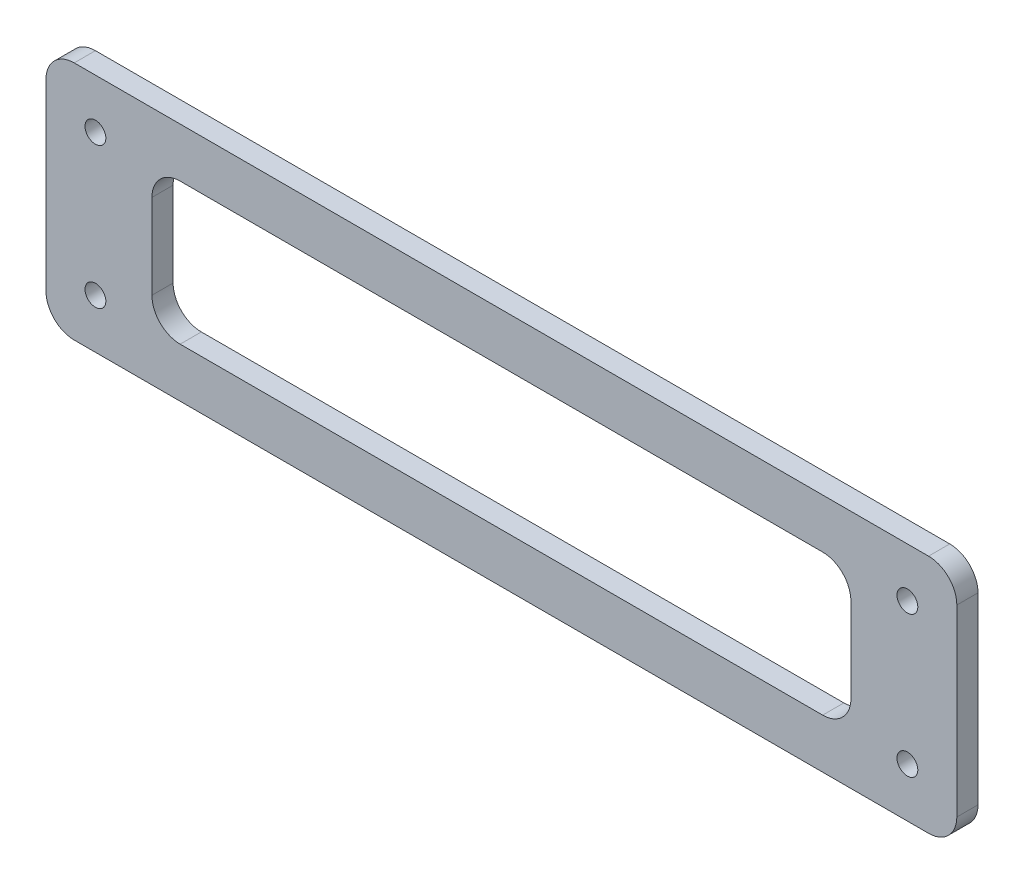
ISO-10303-21;
HEADER;
FILE_DESCRIPTION(('STEP AP214'),'2;1');
FILE_NAME('part.step','',(''),(''),'','','');
FILE_SCHEMA(('AUTOMOTIVE_DESIGN { 1 0 10303 214 1 1 1 1 }'));
ENDSEC;
DATA;
#1=APPLICATION_CONTEXT('core data for automotive mechanical design processes');
#2=APPLICATION_PROTOCOL_DEFINITION('international standard','automotive_design',2000,#1);
#3=PRODUCT_CONTEXT('',#1,'mechanical');
#4=PRODUCT('Part','Part','',(#3));
#5=PRODUCT_RELATED_PRODUCT_CATEGORY('part','',(#4));
#6=PRODUCT_DEFINITION_FORMATION('','',#4);
#7=PRODUCT_DEFINITION_CONTEXT('part definition',#1,'design');
#8=PRODUCT_DEFINITION('design','',#6,#7);
#9=PRODUCT_DEFINITION_SHAPE('','',#8);
#10=(LENGTH_UNIT() NAMED_UNIT(*) SI_UNIT(.MILLI.,.METRE.));
#11=(NAMED_UNIT(*) PLANE_ANGLE_UNIT() SI_UNIT($,.RADIAN.));
#12=(NAMED_UNIT(*) SI_UNIT($,.STERADIAN.) SOLID_ANGLE_UNIT());
#13=UNCERTAINTY_MEASURE_WITH_UNIT(LENGTH_MEASURE(1.E-05),#10,'distance_accuracy_value','');
#14=(GEOMETRIC_REPRESENTATION_CONTEXT(3) GLOBAL_UNCERTAINTY_ASSIGNED_CONTEXT((#13)) GLOBAL_UNIT_ASSIGNED_CONTEXT((#10,
#11,#12)) REPRESENTATION_CONTEXT('',''));
#15=CARTESIAN_POINT('',(0.,0.,0.));
#16=DIRECTION('',(0.,0.,1.));
#17=DIRECTION('',(1.,0.,0.));
#18=AXIS2_PLACEMENT_3D('',#15,#16,#17);
#19=CARTESIAN_POINT('',(0.,0.,3.));
#20=DIRECTION('',(0.,0.,-1.));
#21=DIRECTION('',(-1.,0.,0.));
#22=AXIS2_PLACEMENT_3D('',#19,#20,#21);
#23=PLANE('',#22);
#24=CARTESIAN_POINT('',(57.4999999999999,10.,3.));
#25=DIRECTION('',(0.,0.,1.));
#26=DIRECTION('',(-1.,0.,0.));
#27=AXIS2_PLACEMENT_3D('',#24,#25,#26);
#28=CIRCLE('',#27,1.475);
#29=CARTESIAN_POINT('',(56.0249999999999,10.,3.));
#30=VERTEX_POINT('',#29);
#31=EDGE_CURVE('E316',#30,#30,#28,.T.);
#32=ORIENTED_EDGE('',*,*,#31,.F.);
#33=EDGE_LOOP('',(#32));
#34=FACE_BOUND('',#33,.T.);
#35=CARTESIAN_POINT('',(57.5000000000001,-10.,3.));
#36=DIRECTION('',(0.,0.,1.));
#37=DIRECTION('',(-1.,0.,0.));
#38=AXIS2_PLACEMENT_3D('',#35,#36,#37);
#39=CIRCLE('',#38,1.475);
#40=CARTESIAN_POINT('',(56.0250000000001,-10.,3.));
#41=VERTEX_POINT('',#40);
#42=EDGE_CURVE('E325',#41,#41,#39,.T.);
#43=ORIENTED_EDGE('',*,*,#42,.F.);
#44=EDGE_LOOP('',(#43));
#45=FACE_BOUND('',#44,.T.);
#46=CARTESIAN_POINT('',(-57.5,-10.,3.));
#47=DIRECTION('',(0.,0.,1.));
#48=DIRECTION('',(1.,0.,0.));
#49=AXIS2_PLACEMENT_3D('',#46,#47,#48);
#50=CIRCLE('',#49,1.475);
#51=CARTESIAN_POINT('',(-56.025,-10.,3.));
#52=VERTEX_POINT('',#51);
#53=EDGE_CURVE('E333',#52,#52,#50,.T.);
#54=ORIENTED_EDGE('',*,*,#53,.F.);
#55=EDGE_LOOP('',(#54));
#56=FACE_BOUND('',#55,.T.);
#57=CARTESIAN_POINT('',(-57.5,10.,3.));
#58=DIRECTION('',(0.,0.,1.));
#59=DIRECTION('',(1.,0.,0.));
#60=AXIS2_PLACEMENT_3D('',#57,#58,#59);
#61=CIRCLE('',#60,1.475);
#62=CARTESIAN_POINT('',(-56.025,10.,3.));
#63=VERTEX_POINT('',#62);
#64=EDGE_CURVE('E341',#63,#63,#61,.T.);
#65=ORIENTED_EDGE('',*,*,#64,.F.);
#66=EDGE_LOOP('',(#65));
#67=FACE_BOUND('',#66,.T.);
#68=DIRECTION('',(1.,0.,0.));
#69=VECTOR('',#68,1.);
#70=CARTESIAN_POINT('',(-64.5,-17.,3.));
#71=LINE('',#70,#69);
#72=CARTESIAN_POINT('',(-60.5,-17.,3.));
#73=VERTEX_POINT('',#72);
#74=CARTESIAN_POINT('',(60.5,-17.,3.));
#75=VERTEX_POINT('',#74);
#76=EDGE_CURVE('E186',#73,#75,#71,.T.);
#77=ORIENTED_EDGE('',*,*,#76,.T.);
#78=CARTESIAN_POINT('',(60.5,-13.,3.));
#79=DIRECTION('',(0.,0.,-1.));
#80=DIRECTION('',(-1.,0.,0.));
#81=AXIS2_PLACEMENT_3D('',#78,#79,#80);
#82=CIRCLE('',#81,4.);
#83=CARTESIAN_POINT('',(64.5,-13.,3.));
#84=VERTEX_POINT('',#83);
#85=EDGE_CURVE('E252',#75,#84,#82,.F.);
#86=ORIENTED_EDGE('',*,*,#85,.T.);
#87=DIRECTION('',(0.,1.,0.));
#88=VECTOR('',#87,1.);
#89=CARTESIAN_POINT('',(64.5,-17.,3.));
#90=LINE('',#89,#88);
#91=CARTESIAN_POINT('',(64.5,13.,3.));
#92=VERTEX_POINT('',#91);
#93=EDGE_CURVE('E349',#84,#92,#90,.T.);
#94=ORIENTED_EDGE('',*,*,#93,.T.);
#95=CARTESIAN_POINT('',(60.5,13.,3.));
#96=DIRECTION('',(0.,0.,-1.));
#97=DIRECTION('',(-1.,0.,0.));
#98=AXIS2_PLACEMENT_3D('',#95,#96,#97);
#99=CIRCLE('',#98,4.);
#100=CARTESIAN_POINT('',(60.5,17.,3.));
#101=VERTEX_POINT('',#100);
#102=EDGE_CURVE('E246',#92,#101,#99,.F.);
#103=ORIENTED_EDGE('',*,*,#102,.T.);
#104=DIRECTION('',(-1.,0.,0.));
#105=VECTOR('',#104,1.);
#106=CARTESIAN_POINT('',(-64.5,17.,3.));
#107=LINE('',#106,#105);
#108=CARTESIAN_POINT('',(-60.5,17.,3.));
#109=VERTEX_POINT('',#108);
#110=EDGE_CURVE('E353',#101,#109,#107,.T.);
#111=ORIENTED_EDGE('',*,*,#110,.T.);
#112=CARTESIAN_POINT('',(-60.5,13.,3.));
#113=DIRECTION('',(0.,0.,-1.));
#114=DIRECTION('',(-1.,0.,0.));
#115=AXIS2_PLACEMENT_3D('',#112,#113,#114);
#116=CIRCLE('',#115,4.);
#117=CARTESIAN_POINT('',(-64.5,13.,3.));
#118=VERTEX_POINT('',#117);
#119=EDGE_CURVE('E68',#109,#118,#116,.F.);
#120=ORIENTED_EDGE('',*,*,#119,.T.);
#121=DIRECTION('',(0.,-1.,0.));
#122=VECTOR('',#121,1.);
#123=CARTESIAN_POINT('',(-64.5,-17.,3.));
#124=LINE('',#123,#122);
#125=CARTESIAN_POINT('',(-64.5,-13.,3.));
#126=VERTEX_POINT('',#125);
#127=EDGE_CURVE('E193',#118,#126,#124,.T.);
#128=ORIENTED_EDGE('',*,*,#127,.T.);
#129=CARTESIAN_POINT('',(-60.5,-13.,3.));
#130=DIRECTION('',(0.,0.,-1.));
#131=DIRECTION('',(-1.,0.,0.));
#132=AXIS2_PLACEMENT_3D('',#129,#130,#131);
#133=CIRCLE('',#132,4.);
#134=EDGE_CURVE('E249',#126,#73,#133,.F.);
#135=ORIENTED_EDGE('',*,*,#134,.T.);
#136=EDGE_LOOP('',(#77,#86,#94,#103,#111,#120,#128,#135));
#137=FACE_BOUND('',#136,.T.);
#138=DIRECTION('',(0.,1.,0.));
#139=VECTOR('',#138,1.);
#140=CARTESIAN_POINT('',(49.5,-10.,3.));
#141=LINE('',#140,#139);
#142=CARTESIAN_POINT('',(49.5,-6.,3.));
#143=VERTEX_POINT('',#142);
#144=CARTESIAN_POINT('',(49.5,6.,3.));
#145=VERTEX_POINT('',#144);
#146=EDGE_CURVE('E308',#143,#145,#141,.T.);
#147=ORIENTED_EDGE('',*,*,#146,.F.);
#148=CARTESIAN_POINT('',(45.5,-6.,3.));
#149=DIRECTION('',(0.,0.,-1.));
#150=DIRECTION('',(-1.,0.,0.));
#151=AXIS2_PLACEMENT_3D('',#148,#149,#150);
#152=CIRCLE('',#151,4.);
#153=CARTESIAN_POINT('',(45.5,-10.,3.));
#154=VERTEX_POINT('',#153);
#155=EDGE_CURVE('E11',#143,#154,#152,.T.);
#156=ORIENTED_EDGE('',*,*,#155,.T.);
#157=DIRECTION('',(1.,0.,0.));
#158=VECTOR('',#157,1.);
#159=CARTESIAN_POINT('',(-49.5,-10.,3.));
#160=LINE('',#159,#158);
#161=CARTESIAN_POINT('',(-45.5,-10.,3.));
#162=VERTEX_POINT('',#161);
#163=EDGE_CURVE('E292',#162,#154,#160,.T.);
#164=ORIENTED_EDGE('',*,*,#163,.F.);
#165=CARTESIAN_POINT('',(-45.5,-6.,3.));
#166=DIRECTION('',(0.,0.,-1.));
#167=DIRECTION('',(-1.,0.,0.));
#168=AXIS2_PLACEMENT_3D('',#165,#166,#167);
#169=CIRCLE('',#168,4.);
#170=CARTESIAN_POINT('',(-49.5,-6.,3.));
#171=VERTEX_POINT('',#170);
#172=EDGE_CURVE('E171',#162,#171,#169,.T.);
#173=ORIENTED_EDGE('',*,*,#172,.T.);
#174=DIRECTION('',(0.,-1.,0.));
#175=VECTOR('',#174,1.);
#176=CARTESIAN_POINT('',(-49.5,-10.,3.));
#177=LINE('',#176,#175);
#178=CARTESIAN_POINT('',(-49.5,6.,3.));
#179=VERTEX_POINT('',#178);
#180=EDGE_CURVE('E289',#179,#171,#177,.T.);
#181=ORIENTED_EDGE('',*,*,#180,.F.);
#182=CARTESIAN_POINT('',(-45.5,6.,3.));
#183=DIRECTION('',(0.,0.,-1.));
#184=DIRECTION('',(-1.,0.,0.));
#185=AXIS2_PLACEMENT_3D('',#182,#183,#184);
#186=CIRCLE('',#185,4.);
#187=CARTESIAN_POINT('',(-45.5,10.,3.));
#188=VERTEX_POINT('',#187);
#189=EDGE_CURVE('E277',#179,#188,#186,.T.);
#190=ORIENTED_EDGE('',*,*,#189,.T.);
#191=DIRECTION('',(-1.,0.,0.));
#192=VECTOR('',#191,1.);
#193=CARTESIAN_POINT('',(-49.5,10.,3.));
#194=LINE('',#193,#192);
#195=CARTESIAN_POINT('',(45.5,10.,3.));
#196=VERTEX_POINT('',#195);
#197=EDGE_CURVE('E301',#196,#188,#194,.T.);
#198=ORIENTED_EDGE('',*,*,#197,.F.);
#199=CARTESIAN_POINT('',(45.5,6.,3.));
#200=DIRECTION('',(0.,0.,-1.));
#201=DIRECTION('',(-1.,0.,0.));
#202=AXIS2_PLACEMENT_3D('',#199,#200,#201);
#203=CIRCLE('',#202,4.);
#204=EDGE_CURVE('E271',#196,#145,#203,.T.);
#205=ORIENTED_EDGE('',*,*,#204,.T.);
#206=EDGE_LOOP('',(#147,#156,#164,#173,#181,#190,#198,#205));
#207=FACE_BOUND('',#206,.T.);
#208=ADVANCED_FACE('F45',(#34,#45,#56,#67,#137,#207),#23,.F.);
#209=CARTESIAN_POINT('',(0.,0.,0.));
#210=DIRECTION('',(0.,0.,-1.));
#211=DIRECTION('',(-1.,0.,0.));
#212=AXIS2_PLACEMENT_3D('',#209,#210,#211);
#213=PLANE('',#212);
#214=CARTESIAN_POINT('',(57.5000000000001,-10.,0.));
#215=DIRECTION('',(0.,0.,1.));
#216=DIRECTION('',(-1.,0.,0.));
#217=AXIS2_PLACEMENT_3D('',#214,#215,#216);
#218=CIRCLE('',#217,1.475);
#219=CARTESIAN_POINT('',(56.0250000000001,-10.,0.));
#220=VERTEX_POINT('',#219);
#221=EDGE_CURVE('E320',#220,#220,#218,.T.);
#222=ORIENTED_EDGE('',*,*,#221,.T.);
#223=EDGE_LOOP('',(#222));
#224=FACE_BOUND('',#223,.T.);
#225=CARTESIAN_POINT('',(-57.5,10.,0.));
#226=DIRECTION('',(0.,0.,1.));
#227=DIRECTION('',(1.,0.,0.));
#228=AXIS2_PLACEMENT_3D('',#225,#226,#227);
#229=CIRCLE('',#228,1.475);
#230=CARTESIAN_POINT('',(-56.025,10.,0.));
#231=VERTEX_POINT('',#230);
#232=EDGE_CURVE('E337',#231,#231,#229,.T.);
#233=ORIENTED_EDGE('',*,*,#232,.T.);
#234=EDGE_LOOP('',(#233));
#235=FACE_BOUND('',#234,.T.);
#236=DIRECTION('',(0.,1.,0.));
#237=VECTOR('',#236,1.);
#238=CARTESIAN_POINT('',(64.5,-17.,0.));
#239=LINE('',#238,#237);
#240=CARTESIAN_POINT('',(64.5,-13.,0.));
#241=VERTEX_POINT('',#240);
#242=CARTESIAN_POINT('',(64.5,13.,0.));
#243=VERTEX_POINT('',#242);
#244=EDGE_CURVE('E345',#241,#243,#239,.T.);
#245=ORIENTED_EDGE('',*,*,#244,.F.);
#246=CARTESIAN_POINT('',(60.5,-13.,0.));
#247=DIRECTION('',(0.,0.,-1.));
#248=DIRECTION('',(-1.,0.,0.));
#249=AXIS2_PLACEMENT_3D('',#246,#247,#248);
#250=CIRCLE('',#249,4.);
#251=CARTESIAN_POINT('',(60.5,-17.,0.));
#252=VERTEX_POINT('',#251);
#253=EDGE_CURVE('E234',#241,#252,#250,.T.);
#254=ORIENTED_EDGE('',*,*,#253,.T.);
#255=DIRECTION('',(1.,0.,0.));
#256=VECTOR('',#255,1.);
#257=CARTESIAN_POINT('',(-64.5,-17.,0.));
#258=LINE('',#257,#256);
#259=CARTESIAN_POINT('',(-60.5,-17.,0.));
#260=VERTEX_POINT('',#259);
#261=EDGE_CURVE('E196',#260,#252,#258,.T.);
#262=ORIENTED_EDGE('',*,*,#261,.F.);
#263=CARTESIAN_POINT('',(-60.5,-13.,0.));
#264=DIRECTION('',(0.,0.,-1.));
#265=DIRECTION('',(-1.,0.,0.));
#266=AXIS2_PLACEMENT_3D('',#263,#264,#265);
#267=CIRCLE('',#266,4.);
#268=CARTESIAN_POINT('',(-64.5,-13.,0.));
#269=VERTEX_POINT('',#268);
#270=EDGE_CURVE('E231',#260,#269,#267,.T.);
#271=ORIENTED_EDGE('',*,*,#270,.T.);
#272=DIRECTION('',(0.,-1.,0.));
#273=VECTOR('',#272,1.);
#274=CARTESIAN_POINT('',(-64.5,-17.,0.));
#275=LINE('',#274,#273);
#276=CARTESIAN_POINT('',(-64.5,13.,0.));
#277=VERTEX_POINT('',#276);
#278=EDGE_CURVE('E364',#277,#269,#275,.T.);
#279=ORIENTED_EDGE('',*,*,#278,.F.);
#280=CARTESIAN_POINT('',(-60.5,13.,0.));
#281=DIRECTION('',(0.,0.,-1.));
#282=DIRECTION('',(-1.,0.,0.));
#283=AXIS2_PLACEMENT_3D('',#280,#281,#282);
#284=CIRCLE('',#283,4.);
#285=CARTESIAN_POINT('',(-60.5,17.,0.));
#286=VERTEX_POINT('',#285);
#287=EDGE_CURVE('E225',#277,#286,#284,.T.);
#288=ORIENTED_EDGE('',*,*,#287,.T.);
#289=DIRECTION('',(-1.,0.,0.));
#290=VECTOR('',#289,1.);
#291=CARTESIAN_POINT('',(-64.5,17.,0.));
#292=LINE('',#291,#290);
#293=CARTESIAN_POINT('',(60.5,17.,0.));
#294=VERTEX_POINT('',#293);
#295=EDGE_CURVE('E361',#294,#286,#292,.T.);
#296=ORIENTED_EDGE('',*,*,#295,.F.);
#297=CARTESIAN_POINT('',(60.5,13.,0.));
#298=DIRECTION('',(0.,0.,-1.));
#299=DIRECTION('',(-1.,0.,0.));
#300=AXIS2_PLACEMENT_3D('',#297,#298,#299);
#301=CIRCLE('',#300,4.);
#302=EDGE_CURVE('E228',#294,#243,#301,.T.);
#303=ORIENTED_EDGE('',*,*,#302,.T.);
#304=EDGE_LOOP('',(#245,#254,#262,#271,#279,#288,#296,#303));
#305=FACE_BOUND('',#304,.T.);
#306=CARTESIAN_POINT('',(-57.5,-10.,0.));
#307=DIRECTION('',(0.,0.,1.));
#308=DIRECTION('',(1.,0.,0.));
#309=AXIS2_PLACEMENT_3D('',#306,#307,#308);
#310=CIRCLE('',#309,1.475);
#311=CARTESIAN_POINT('',(-56.025,-10.,0.));
#312=VERTEX_POINT('',#311);
#313=EDGE_CURVE('E329',#312,#312,#310,.T.);
#314=ORIENTED_EDGE('',*,*,#313,.T.);
#315=EDGE_LOOP('',(#314));
#316=FACE_BOUND('',#315,.T.);
#317=CARTESIAN_POINT('',(57.4999999999999,10.,0.));
#318=DIRECTION('',(0.,0.,1.));
#319=DIRECTION('',(-1.,0.,0.));
#320=AXIS2_PLACEMENT_3D('',#317,#318,#319);
#321=CIRCLE('',#320,1.475);
#322=CARTESIAN_POINT('',(56.0249999999999,10.,0.));
#323=VERTEX_POINT('',#322);
#324=EDGE_CURVE('E321',#323,#323,#321,.T.);
#325=ORIENTED_EDGE('',*,*,#324,.T.);
#326=EDGE_LOOP('',(#325));
#327=FACE_BOUND('',#326,.T.);
#328=DIRECTION('',(0.,-1.,0.));
#329=VECTOR('',#328,1.);
#330=CARTESIAN_POINT('',(-49.5,-10.,0.));
#331=LINE('',#330,#329);
#332=CARTESIAN_POINT('',(-49.5,6.,0.));
#333=VERTEX_POINT('',#332);
#334=CARTESIAN_POINT('',(-49.5,-6.,0.));
#335=VERTEX_POINT('',#334);
#336=EDGE_CURVE('E304',#333,#335,#331,.T.);
#337=ORIENTED_EDGE('',*,*,#336,.T.);
#338=CARTESIAN_POINT('',(-45.5,-6.,0.));
#339=DIRECTION('',(0.,0.,-1.));
#340=DIRECTION('',(-1.,0.,0.));
#341=AXIS2_PLACEMENT_3D('',#338,#339,#340);
#342=CIRCLE('',#341,4.);
#343=CARTESIAN_POINT('',(-45.5,-10.,0.));
#344=VERTEX_POINT('',#343);
#345=EDGE_CURVE('E280',#335,#344,#342,.F.);
#346=ORIENTED_EDGE('',*,*,#345,.T.);
#347=DIRECTION('',(1.,0.,0.));
#348=VECTOR('',#347,1.);
#349=CARTESIAN_POINT('',(-49.5,-10.,0.));
#350=LINE('',#349,#348);
#351=CARTESIAN_POINT('',(45.5,-10.,0.));
#352=VERTEX_POINT('',#351);
#353=EDGE_CURVE('E165',#344,#352,#350,.T.);
#354=ORIENTED_EDGE('',*,*,#353,.T.);
#355=CARTESIAN_POINT('',(45.5,-6.,0.));
#356=DIRECTION('',(0.,0.,-1.));
#357=DIRECTION('',(-1.,0.,0.));
#358=AXIS2_PLACEMENT_3D('',#355,#356,#357);
#359=CIRCLE('',#358,4.);
#360=CARTESIAN_POINT('',(49.5,-6.,0.));
#361=VERTEX_POINT('',#360);
#362=EDGE_CURVE('E54',#352,#361,#359,.F.);
#363=ORIENTED_EDGE('',*,*,#362,.T.);
#364=DIRECTION('',(0.,1.,0.));
#365=VECTOR('',#364,1.);
#366=CARTESIAN_POINT('',(49.5,-10.,0.));
#367=LINE('',#366,#365);
#368=CARTESIAN_POINT('',(49.5,6.,0.));
#369=VERTEX_POINT('',#368);
#370=EDGE_CURVE('E163',#361,#369,#367,.T.);
#371=ORIENTED_EDGE('',*,*,#370,.T.);
#372=CARTESIAN_POINT('',(45.5,6.,0.));
#373=DIRECTION('',(0.,0.,-1.));
#374=DIRECTION('',(-1.,0.,0.));
#375=AXIS2_PLACEMENT_3D('',#372,#373,#374);
#376=CIRCLE('',#375,4.);
#377=CARTESIAN_POINT('',(45.5,10.,0.));
#378=VERTEX_POINT('',#377);
#379=EDGE_CURVE('E268',#369,#378,#376,.F.);
#380=ORIENTED_EDGE('',*,*,#379,.T.);
#381=DIRECTION('',(-1.,0.,0.));
#382=VECTOR('',#381,1.);
#383=CARTESIAN_POINT('',(-49.5,10.,0.));
#384=LINE('',#383,#382);
#385=CARTESIAN_POINT('',(-45.5,10.,0.));
#386=VERTEX_POINT('',#385);
#387=EDGE_CURVE('E181',#378,#386,#384,.T.);
#388=ORIENTED_EDGE('',*,*,#387,.T.);
#389=CARTESIAN_POINT('',(-45.5,6.,0.));
#390=DIRECTION('',(0.,0.,-1.));
#391=DIRECTION('',(-1.,0.,0.));
#392=AXIS2_PLACEMENT_3D('',#389,#390,#391);
#393=CIRCLE('',#392,4.);
#394=EDGE_CURVE('E274',#386,#333,#393,.F.);
#395=ORIENTED_EDGE('',*,*,#394,.T.);
#396=EDGE_LOOP('',(#337,#346,#354,#363,#371,#380,#388,#395));
#397=FACE_BOUND('',#396,.T.);
#398=ADVANCED_FACE('F162',(#224,#235,#305,#316,#327,#397),#213,.T.);
#399=CARTESIAN_POINT('',(64.5,-17.,3.));
#400=DIRECTION('',(-1.,0.,0.));
#401=DIRECTION('',(0.,-1.,0.));
#402=AXIS2_PLACEMENT_3D('',#399,#400,#401);
#403=PLANE('',#402);
#404=ORIENTED_EDGE('',*,*,#93,.F.);
#405=DIRECTION('',(0.,0.,-1.));
#406=VECTOR('',#405,1.);
#407=CARTESIAN_POINT('',(64.5,-13.,3.));
#408=LINE('',#407,#406);
#409=EDGE_CURVE('E221',#84,#241,#408,.T.);
#410=ORIENTED_EDGE('',*,*,#409,.T.);
#411=ORIENTED_EDGE('',*,*,#244,.T.);
#412=DIRECTION('',(0.,0.,-1.));
#413=VECTOR('',#412,1.);
#414=CARTESIAN_POINT('',(64.5,13.,3.));
#415=LINE('',#414,#413);
#416=EDGE_CURVE('E218',#243,#92,#415,.F.);
#417=ORIENTED_EDGE('',*,*,#416,.T.);
#418=EDGE_LOOP('',(#404,#410,#411,#417));
#419=FACE_BOUND('',#418,.T.);
#420=ADVANCED_FACE('F383',(#419),#403,.F.);
#421=CARTESIAN_POINT('',(-64.5,17.,3.));
#422=DIRECTION('',(0.,-1.,0.));
#423=DIRECTION('',(0.,0.,-1.));
#424=AXIS2_PLACEMENT_3D('',#421,#422,#423);
#425=PLANE('',#424);
#426=ORIENTED_EDGE('',*,*,#110,.F.);
#427=DIRECTION('',(0.,0.,-1.));
#428=VECTOR('',#427,1.);
#429=CARTESIAN_POINT('',(60.5,17.,3.));
#430=LINE('',#429,#428);
#431=EDGE_CURVE('E264',#101,#294,#430,.T.);
#432=ORIENTED_EDGE('',*,*,#431,.T.);
#433=ORIENTED_EDGE('',*,*,#295,.T.);
#434=DIRECTION('',(0.,0.,-1.));
#435=VECTOR('',#434,1.);
#436=CARTESIAN_POINT('',(-60.5,17.,3.));
#437=LINE('',#436,#435);
#438=EDGE_CURVE('E261',#286,#109,#437,.F.);
#439=ORIENTED_EDGE('',*,*,#438,.T.);
#440=EDGE_LOOP('',(#426,#432,#433,#439));
#441=FACE_BOUND('',#440,.T.);
#442=ADVANCED_FACE('F391',(#441),#425,.F.);
#443=CARTESIAN_POINT('',(-64.5,-17.,3.));
#444=DIRECTION('',(1.,0.,0.));
#445=DIRECTION('',(0.,1.,0.));
#446=AXIS2_PLACEMENT_3D('',#443,#444,#445);
#447=PLANE('',#446);
#448=ORIENTED_EDGE('',*,*,#278,.T.);
#449=DIRECTION('',(0.,0.,-1.));
#450=VECTOR('',#449,1.);
#451=CARTESIAN_POINT('',(-64.5,-13.,3.));
#452=LINE('',#451,#450);
#453=EDGE_CURVE('E61',#269,#126,#452,.F.);
#454=ORIENTED_EDGE('',*,*,#453,.T.);
#455=ORIENTED_EDGE('',*,*,#127,.F.);
#456=DIRECTION('',(0.,0.,-1.));
#457=VECTOR('',#456,1.);
#458=CARTESIAN_POINT('',(-64.5,13.,3.));
#459=LINE('',#458,#457);
#460=EDGE_CURVE('E255',#118,#277,#459,.T.);
#461=ORIENTED_EDGE('',*,*,#460,.T.);
#462=EDGE_LOOP('',(#448,#454,#455,#461));
#463=FACE_BOUND('',#462,.T.);
#464=ADVANCED_FACE('F396',(#463),#447,.F.);
#465=CARTESIAN_POINT('',(-64.5,-17.,3.));
#466=DIRECTION('',(0.,1.,0.));
#467=DIRECTION('',(0.,0.,1.));
#468=AXIS2_PLACEMENT_3D('',#465,#466,#467);
#469=PLANE('',#468);
#470=ORIENTED_EDGE('',*,*,#261,.T.);
#471=DIRECTION('',(0.,0.,-1.));
#472=VECTOR('',#471,1.);
#473=CARTESIAN_POINT('',(60.5,-17.,3.));
#474=LINE('',#473,#472);
#475=EDGE_CURVE('E241',#252,#75,#474,.F.);
#476=ORIENTED_EDGE('',*,*,#475,.T.);
#477=ORIENTED_EDGE('',*,*,#76,.F.);
#478=DIRECTION('',(0.,0.,-1.));
#479=VECTOR('',#478,1.);
#480=CARTESIAN_POINT('',(-60.5,-17.,3.));
#481=LINE('',#480,#479);
#482=EDGE_CURVE('E237',#73,#260,#481,.T.);
#483=ORIENTED_EDGE('',*,*,#482,.T.);
#484=EDGE_LOOP('',(#470,#476,#477,#483));
#485=FACE_BOUND('',#484,.T.);
#486=ADVANCED_FACE('F372',(#485),#469,.F.);
#487=CARTESIAN_POINT('',(-57.5,10.,3.));
#488=DIRECTION('',(0.,0.,-1.));
#489=DIRECTION('',(-1.,0.,0.));
#490=AXIS2_PLACEMENT_3D('',#487,#488,#489);
#491=CYLINDRICAL_SURFACE('',#490,1.475);
#492=ORIENTED_EDGE('',*,*,#64,.T.);
#493=EDGE_LOOP('',(#492));
#494=FACE_BOUND('',#493,.T.);
#495=ORIENTED_EDGE('',*,*,#232,.F.);
#496=EDGE_LOOP('',(#495));
#497=FACE_BOUND('',#496,.T.);
#498=ADVANCED_FACE('F420',(#494,#497),#491,.F.);
#499=CARTESIAN_POINT('',(-57.5,-10.,3.));
#500=DIRECTION('',(0.,0.,-1.));
#501=DIRECTION('',(-1.,0.,0.));
#502=AXIS2_PLACEMENT_3D('',#499,#500,#501);
#503=CYLINDRICAL_SURFACE('',#502,1.475);
#504=ORIENTED_EDGE('',*,*,#53,.T.);
#505=EDGE_LOOP('',(#504));
#506=FACE_BOUND('',#505,.T.);
#507=ORIENTED_EDGE('',*,*,#313,.F.);
#508=EDGE_LOOP('',(#507));
#509=FACE_BOUND('',#508,.T.);
#510=ADVANCED_FACE('F531',(#506,#509),#503,.F.);
#511=CARTESIAN_POINT('',(57.5000000000001,-10.,3.));
#512=DIRECTION('',(0.,0.,-1.));
#513=DIRECTION('',(-1.,0.,0.));
#514=AXIS2_PLACEMENT_3D('',#511,#512,#513);
#515=CYLINDRICAL_SURFACE('',#514,1.475);
#516=ORIENTED_EDGE('',*,*,#42,.T.);
#517=EDGE_LOOP('',(#516));
#518=FACE_BOUND('',#517,.T.);
#519=ORIENTED_EDGE('',*,*,#221,.F.);
#520=EDGE_LOOP('',(#519));
#521=FACE_BOUND('',#520,.T.);
#522=ADVANCED_FACE('F522',(#518,#521),#515,.F.);
#523=CARTESIAN_POINT('',(57.4999999999999,10.,3.));
#524=DIRECTION('',(0.,0.,-1.));
#525=DIRECTION('',(-1.,0.,0.));
#526=AXIS2_PLACEMENT_3D('',#523,#524,#525);
#527=CYLINDRICAL_SURFACE('',#526,1.475);
#528=ORIENTED_EDGE('',*,*,#31,.T.);
#529=EDGE_LOOP('',(#528));
#530=FACE_BOUND('',#529,.T.);
#531=ORIENTED_EDGE('',*,*,#324,.F.);
#532=EDGE_LOOP('',(#531));
#533=FACE_BOUND('',#532,.T.);
#534=ADVANCED_FACE('F515',(#530,#533),#527,.F.);
#535=CARTESIAN_POINT('',(49.5,-10.,3.));
#536=DIRECTION('',(-1.,0.,0.));
#537=DIRECTION('',(0.,0.,1.));
#538=AXIS2_PLACEMENT_3D('',#535,#536,#537);
#539=PLANE('',#538);
#540=ORIENTED_EDGE('',*,*,#146,.T.);
#541=DIRECTION('',(0.,0.,-1.));
#542=VECTOR('',#541,1.);
#543=CARTESIAN_POINT('',(49.5,6.,0.));
#544=LINE('',#543,#542);
#545=EDGE_CURVE('E179',#145,#369,#544,.T.);
#546=ORIENTED_EDGE('',*,*,#545,.T.);
#547=ORIENTED_EDGE('',*,*,#370,.F.);
#548=DIRECTION('',(0.,0.,-1.));
#549=VECTOR('',#548,1.);
#550=CARTESIAN_POINT('',(49.5,-6.,3.));
#551=LINE('',#550,#549);
#552=EDGE_CURVE('E176',#361,#143,#551,.F.);
#553=ORIENTED_EDGE('',*,*,#552,.T.);
#554=EDGE_LOOP('',(#540,#546,#547,#553));
#555=FACE_BOUND('',#554,.T.);
#556=ADVANCED_FACE('F175',(#555),#539,.T.);
#557=CARTESIAN_POINT('',(-49.5,10.,3.));
#558=DIRECTION('',(0.,-1.,0.));
#559=DIRECTION('',(0.,0.,-1.));
#560=AXIS2_PLACEMENT_3D('',#557,#558,#559);
#561=PLANE('',#560);
#562=ORIENTED_EDGE('',*,*,#387,.F.);
#563=DIRECTION('',(0.,0.,-1.));
#564=VECTOR('',#563,1.);
#565=CARTESIAN_POINT('',(45.5,10.,3.));
#566=LINE('',#565,#564);
#567=EDGE_CURVE('E202',#378,#196,#566,.F.);
#568=ORIENTED_EDGE('',*,*,#567,.T.);
#569=ORIENTED_EDGE('',*,*,#197,.T.);
#570=DIRECTION('',(0.,0.,-1.));
#571=VECTOR('',#570,1.);
#572=CARTESIAN_POINT('',(-45.5,10.,0.));
#573=LINE('',#572,#571);
#574=EDGE_CURVE('E190',#188,#386,#573,.T.);
#575=ORIENTED_EDGE('',*,*,#574,.T.);
#576=EDGE_LOOP('',(#562,#568,#569,#575));
#577=FACE_BOUND('',#576,.T.);
#578=ADVANCED_FACE('F499',(#577),#561,.T.);
#579=CARTESIAN_POINT('',(-49.5,-10.,3.));
#580=DIRECTION('',(1.,0.,0.));
#581=DIRECTION('',(0.,0.,-1.));
#582=AXIS2_PLACEMENT_3D('',#579,#580,#581);
#583=PLANE('',#582);
#584=ORIENTED_EDGE('',*,*,#336,.F.);
#585=DIRECTION('',(0.,0.,-1.));
#586=VECTOR('',#585,1.);
#587=CARTESIAN_POINT('',(-49.5,6.,3.));
#588=LINE('',#587,#586);
#589=EDGE_CURVE('E209',#333,#179,#588,.F.);
#590=ORIENTED_EDGE('',*,*,#589,.T.);
#591=ORIENTED_EDGE('',*,*,#180,.T.);
#592=DIRECTION('',(0.,0.,-1.));
#593=VECTOR('',#592,1.);
#594=CARTESIAN_POINT('',(-49.5,-6.,0.));
#595=LINE('',#594,#593);
#596=EDGE_CURVE('E205',#171,#335,#595,.T.);
#597=ORIENTED_EDGE('',*,*,#596,.T.);
#598=EDGE_LOOP('',(#584,#590,#591,#597));
#599=FACE_BOUND('',#598,.T.);
#600=ADVANCED_FACE('F298',(#599),#583,.T.);
#601=CARTESIAN_POINT('',(-49.5,-10.,3.));
#602=DIRECTION('',(0.,1.,0.));
#603=DIRECTION('',(0.,0.,1.));
#604=AXIS2_PLACEMENT_3D('',#601,#602,#603);
#605=PLANE('',#604);
#606=ORIENTED_EDGE('',*,*,#353,.F.);
#607=DIRECTION('',(0.,0.,-1.));
#608=VECTOR('',#607,1.);
#609=CARTESIAN_POINT('',(-45.5,-10.,3.));
#610=LINE('',#609,#608);
#611=EDGE_CURVE('E215',#344,#162,#610,.F.);
#612=ORIENTED_EDGE('',*,*,#611,.T.);
#613=ORIENTED_EDGE('',*,*,#163,.T.);
#614=DIRECTION('',(0.,0.,-1.));
#615=VECTOR('',#614,1.);
#616=CARTESIAN_POINT('',(45.5,-10.,0.));
#617=LINE('',#616,#615);
#618=EDGE_CURVE('E212',#154,#352,#617,.T.);
#619=ORIENTED_EDGE('',*,*,#618,.T.);
#620=EDGE_LOOP('',(#606,#612,#613,#619));
#621=FACE_BOUND('',#620,.T.);
#622=ADVANCED_FACE('F306',(#621),#605,.T.);
#623=CARTESIAN_POINT('',(45.5,6.,3.));
#624=DIRECTION('',(0.,0.,1.));
#625=DIRECTION('',(1.,0.,0.));
#626=AXIS2_PLACEMENT_3D('',#623,#624,#625);
#627=CYLINDRICAL_SURFACE('',#626,4.);
#628=ORIENTED_EDGE('',*,*,#204,.F.);
#629=ORIENTED_EDGE('',*,*,#567,.F.);
#630=ORIENTED_EDGE('',*,*,#379,.F.);
#631=ORIENTED_EDGE('',*,*,#545,.F.);
#632=EDGE_LOOP('',(#628,#629,#630,#631));
#633=FACE_BOUND('',#632,.T.);
#634=ADVANCED_FACE('F431',(#633),#627,.F.);
#635=CARTESIAN_POINT('',(-45.5,6.,3.));
#636=DIRECTION('',(0.,0.,1.));
#637=DIRECTION('',(1.,0.,0.));
#638=AXIS2_PLACEMENT_3D('',#635,#636,#637);
#639=CYLINDRICAL_SURFACE('',#638,4.);
#640=ORIENTED_EDGE('',*,*,#189,.F.);
#641=ORIENTED_EDGE('',*,*,#589,.F.);
#642=ORIENTED_EDGE('',*,*,#394,.F.);
#643=ORIENTED_EDGE('',*,*,#574,.F.);
#644=EDGE_LOOP('',(#640,#641,#642,#643));
#645=FACE_BOUND('',#644,.T.);
#646=ADVANCED_FACE('F434',(#645),#639,.F.);
#647=CARTESIAN_POINT('',(-45.5,-6.,3.));
#648=DIRECTION('',(0.,0.,1.));
#649=DIRECTION('',(1.,0.,0.));
#650=AXIS2_PLACEMENT_3D('',#647,#648,#649);
#651=CYLINDRICAL_SURFACE('',#650,4.);
#652=ORIENTED_EDGE('',*,*,#172,.F.);
#653=ORIENTED_EDGE('',*,*,#611,.F.);
#654=ORIENTED_EDGE('',*,*,#345,.F.);
#655=ORIENTED_EDGE('',*,*,#596,.F.);
#656=EDGE_LOOP('',(#652,#653,#654,#655));
#657=FACE_BOUND('',#656,.T.);
#658=ADVANCED_FACE('F303',(#657),#651,.F.);
#659=CARTESIAN_POINT('',(45.5,-6.,3.));
#660=DIRECTION('',(0.,0.,1.));
#661=DIRECTION('',(1.,0.,0.));
#662=AXIS2_PLACEMENT_3D('',#659,#660,#661);
#663=CYLINDRICAL_SURFACE('',#662,4.);
#664=ORIENTED_EDGE('',*,*,#155,.F.);
#665=ORIENTED_EDGE('',*,*,#552,.F.);
#666=ORIENTED_EDGE('',*,*,#362,.F.);
#667=ORIENTED_EDGE('',*,*,#618,.F.);
#668=EDGE_LOOP('',(#664,#665,#666,#667));
#669=FACE_BOUND('',#668,.T.);
#670=ADVANCED_FACE('F184',(#669),#663,.F.);
#671=CARTESIAN_POINT('',(60.5,-13.,3.));
#672=DIRECTION('',(0.,0.,-1.));
#673=DIRECTION('',(-1.,0.,0.));
#674=AXIS2_PLACEMENT_3D('',#671,#672,#673);
#675=CYLINDRICAL_SURFACE('',#674,4.);
#676=ORIENTED_EDGE('',*,*,#85,.F.);
#677=ORIENTED_EDGE('',*,*,#475,.F.);
#678=ORIENTED_EDGE('',*,*,#253,.F.);
#679=ORIENTED_EDGE('',*,*,#409,.F.);
#680=EDGE_LOOP('',(#676,#677,#678,#679));
#681=FACE_BOUND('',#680,.T.);
#682=ADVANCED_FACE('F378',(#681),#675,.T.);
#683=CARTESIAN_POINT('',(-60.5,-13.,3.));
#684=DIRECTION('',(0.,0.,-1.));
#685=DIRECTION('',(-1.,0.,0.));
#686=AXIS2_PLACEMENT_3D('',#683,#684,#685);
#687=CYLINDRICAL_SURFACE('',#686,4.);
#688=ORIENTED_EDGE('',*,*,#134,.F.);
#689=ORIENTED_EDGE('',*,*,#453,.F.);
#690=ORIENTED_EDGE('',*,*,#270,.F.);
#691=ORIENTED_EDGE('',*,*,#482,.F.);
#692=EDGE_LOOP('',(#688,#689,#690,#691));
#693=FACE_BOUND('',#692,.T.);
#694=ADVANCED_FACE('F400',(#693),#687,.T.);
#695=CARTESIAN_POINT('',(60.5,13.,3.));
#696=DIRECTION('',(0.,0.,-1.));
#697=DIRECTION('',(-1.,0.,0.));
#698=AXIS2_PLACEMENT_3D('',#695,#696,#697);
#699=CYLINDRICAL_SURFACE('',#698,4.);
#700=ORIENTED_EDGE('',*,*,#102,.F.);
#701=ORIENTED_EDGE('',*,*,#416,.F.);
#702=ORIENTED_EDGE('',*,*,#302,.F.);
#703=ORIENTED_EDGE('',*,*,#431,.F.);
#704=EDGE_LOOP('',(#700,#701,#702,#703));
#705=FACE_BOUND('',#704,.T.);
#706=ADVANCED_FACE('F387',(#705),#699,.T.);
#707=CARTESIAN_POINT('',(-60.5,13.,3.));
#708=DIRECTION('',(0.,0.,-1.));
#709=DIRECTION('',(-1.,0.,0.));
#710=AXIS2_PLACEMENT_3D('',#707,#708,#709);
#711=CYLINDRICAL_SURFACE('',#710,4.);
#712=ORIENTED_EDGE('',*,*,#119,.F.);
#713=ORIENTED_EDGE('',*,*,#438,.F.);
#714=ORIENTED_EDGE('',*,*,#287,.F.);
#715=ORIENTED_EDGE('',*,*,#460,.F.);
#716=EDGE_LOOP('',(#712,#713,#714,#715));
#717=FACE_BOUND('',#716,.T.);
#718=ADVANCED_FACE('F47',(#717),#711,.T.);
#719=CLOSED_SHELL('',(#208,#398,#420,#442,#464,#486,#498,#510,#522,#534,#556,#578,#600,#622,
#634,#646,#658,#670,#682,#694,#706,#718));
#720=MANIFOLD_SOLID_BREP('B2',#719);
#721=ADVANCED_BREP_SHAPE_REPRESENTATION('',(#18,#720),#14);
#722=SHAPE_DEFINITION_REPRESENTATION(#9,#721);
ENDSEC;
END-ISO-10303-21;
